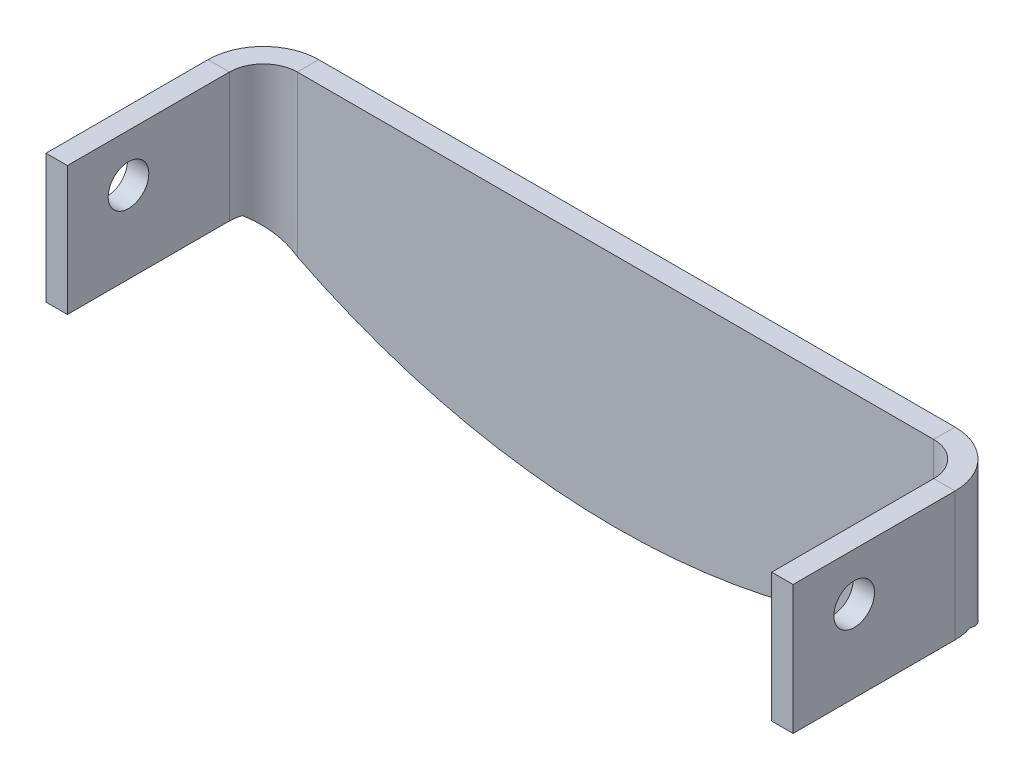
ISO-10303-21;
HEADER;
FILE_DESCRIPTION(('STEP AP214'),'2;1');
FILE_NAME('part.step','',(''),(''),'','','');
FILE_SCHEMA(('AUTOMOTIVE_DESIGN { 1 0 10303 214 1 1 1 1 }'));
ENDSEC;
DATA;
#1=APPLICATION_CONTEXT('core data for automotive mechanical design processes');
#2=APPLICATION_PROTOCOL_DEFINITION('international standard','automotive_design',2000,#1);
#3=PRODUCT_CONTEXT('',#1,'mechanical');
#4=PRODUCT('Part','Part','',(#3));
#5=PRODUCT_RELATED_PRODUCT_CATEGORY('part','',(#4));
#6=PRODUCT_DEFINITION_FORMATION('','',#4);
#7=PRODUCT_DEFINITION_CONTEXT('part definition',#1,'design');
#8=PRODUCT_DEFINITION('design','',#6,#7);
#9=PRODUCT_DEFINITION_SHAPE('','',#8);
#10=(LENGTH_UNIT() NAMED_UNIT(*) SI_UNIT(.MILLI.,.METRE.));
#11=(NAMED_UNIT(*) PLANE_ANGLE_UNIT() SI_UNIT($,.RADIAN.));
#12=(NAMED_UNIT(*) SI_UNIT($,.STERADIAN.) SOLID_ANGLE_UNIT());
#13=UNCERTAINTY_MEASURE_WITH_UNIT(LENGTH_MEASURE(1.E-05),#10,'distance_accuracy_value','');
#14=(GEOMETRIC_REPRESENTATION_CONTEXT(3) GLOBAL_UNCERTAINTY_ASSIGNED_CONTEXT((#13)) GLOBAL_UNIT_ASSIGNED_CONTEXT((#10,
#11,#12)) REPRESENTATION_CONTEXT('',''));
#15=CARTESIAN_POINT('',(0.,0.,0.));
#16=DIRECTION('',(0.,0.,1.));
#17=DIRECTION('',(1.,0.,0.));
#18=AXIS2_PLACEMENT_3D('',#15,#16,#17);
#19=CARTESIAN_POINT('',(0.,44.2833700829048,-0.3998));
#20=DIRECTION('',(0.,0.,1.));
#21=DIRECTION('',(1.,0.,0.));
#22=AXIS2_PLACEMENT_3D('',#19,#20,#21);
#23=PLANE('',#22);
#24=DIRECTION('',(1.,0.,0.));
#25=VECTOR('',#24,1.);
#26=CARTESIAN_POINT('',(0.,0.,-0.3998));
#27=LINE('',#26,#25);
#28=CARTESIAN_POINT('',(29.7536626678157,0.,-0.3998));
#29=VERTEX_POINT('',#28);
#30=CARTESIAN_POINT('',(-29.7536626678156,0.,-0.3998));
#31=VERTEX_POINT('',#30);
#32=EDGE_CURVE('E73',#29,#31,#27,.F.);
#33=ORIENTED_EDGE('',*,*,#32,.F.);
#34=DIRECTION('',(0.,-1.,0.));
#35=VECTOR('',#34,1.);
#36=CARTESIAN_POINT('',(29.7536626678157,44.2833700829048,-0.3998));
#37=LINE('',#36,#35);
#38=CARTESIAN_POINT('',(29.7536626678157,-14.9586251050515,-0.3998));
#39=VERTEX_POINT('',#38);
#40=EDGE_CURVE('E65',#29,#39,#37,.T.);
#41=ORIENTED_EDGE('',*,*,#40,.T.);
#42=CARTESIAN_POINT('',(0.,44.2833700829048,-0.3998));
#43=DIRECTION('',(0.,0.,1.));
#44=DIRECTION('',(1.,0.,0.));
#45=AXIS2_PLACEMENT_3D('',#42,#43,#44);
#46=CIRCLE('',#45,66.294);
#47=CARTESIAN_POINT('',(-29.7536626678156,-14.9586251050515,-0.3998));
#48=VERTEX_POINT('',#47);
#49=EDGE_CURVE('E81',#48,#39,#46,.T.);
#50=ORIENTED_EDGE('',*,*,#49,.F.);
#51=DIRECTION('',(0.,-1.,0.));
#52=VECTOR('',#51,1.);
#53=CARTESIAN_POINT('',(-29.7536626678156,44.2833700829048,-0.3998));
#54=LINE('',#53,#52);
#55=EDGE_CURVE('E542',#31,#48,#54,.T.);
#56=ORIENTED_EDGE('',*,*,#55,.F.);
#57=EDGE_LOOP('',(#33,#41,#50,#56));
#58=FACE_BOUND('',#57,.T.);
#59=ADVANCED_FACE('F56',(#58),#23,.F.);
#60=CARTESIAN_POINT('',(0.,44.2833700829048,1.6002));
#61=DIRECTION('',(0.,0.,1.));
#62=DIRECTION('',(1.,0.,0.));
#63=AXIS2_PLACEMENT_3D('',#60,#61,#62);
#64=CYLINDRICAL_SURFACE('',#63,66.294);
#65=CARTESIAN_POINT('',(29.7536626678157,-14.9586251050515,1.6002));
#66=CARTESIAN_POINT('',(29.7536626678156,-14.9586251050515,-0.3998));
#67=B_SPLINE_CURVE_WITH_KNOTS('',1,(#65,#66),.UNSPECIFIED.,.F.,.F.,(2,2),(0.,1.),.UNSPECIFIED.);
#68=CARTESIAN_POINT('',(29.7536626678157,-14.9586251050515,1.6002));
#69=VERTEX_POINT('',#68);
#70=EDGE_CURVE('E269',#69,#39,#67,.T.);
#71=ORIENTED_EDGE('',*,*,#70,.F.);
#72=CARTESIAN_POINT('',(0.,44.2833700829048,1.6002));
#73=DIRECTION('',(0.,0.,1.));
#74=DIRECTION('',(1.,0.,0.));
#75=AXIS2_PLACEMENT_3D('',#72,#73,#74);
#76=CIRCLE('',#75,66.294);
#77=CARTESIAN_POINT('',(-29.7536626678156,-14.9586251050515,1.6002));
#78=VERTEX_POINT('',#77);
#79=EDGE_CURVE('E462',#78,#69,#76,.T.);
#80=ORIENTED_EDGE('',*,*,#79,.F.);
#81=CARTESIAN_POINT('',(-29.7536626678156,-14.9586251050515,-0.3998));
#82=CARTESIAN_POINT('',(-29.7536626678156,-14.9586251050515,1.6002));
#83=B_SPLINE_CURVE_WITH_KNOTS('',1,(#81,#82),.UNSPECIFIED.,.F.,.F.,(2,2),(0.,1.),.UNSPECIFIED.);
#84=EDGE_CURVE('E463',#78,#48,#83,.F.);
#85=ORIENTED_EDGE('',*,*,#84,.T.);
#86=ORIENTED_EDGE('',*,*,#49,.T.);
#87=EDGE_LOOP('',(#71,#80,#85,#86));
#88=FACE_BOUND('',#87,.T.);
#89=ADVANCED_FACE('F401',(#88),#64,.T.);
#90=CARTESIAN_POINT('',(0.,0.,1.6002));
#91=DIRECTION('',(0.,1.,0.));
#92=DIRECTION('',(-1.,0.,0.));
#93=AXIS2_PLACEMENT_3D('',#90,#91,#92);
#94=PLANE('',#93);
#95=DIRECTION('',(0.,0.,1.));
#96=VECTOR('',#95,1.);
#97=CARTESIAN_POINT('',(29.7536626678157,0.,1.6002));
#98=LINE('',#97,#96);
#99=CARTESIAN_POINT('',(29.7536626678157,0.,1.6002));
#100=VERTEX_POINT('',#99);
#101=EDGE_CURVE('E12',#29,#100,#98,.T.);
#102=ORIENTED_EDGE('',*,*,#101,.F.);
#103=ORIENTED_EDGE('',*,*,#32,.T.);
#104=DIRECTION('',(0.,0.,1.));
#105=VECTOR('',#104,1.);
#106=CARTESIAN_POINT('',(-29.7536626678156,0.,1.6002));
#107=LINE('',#106,#105);
#108=CARTESIAN_POINT('',(-29.7536626678156,0.,1.6002));
#109=VERTEX_POINT('',#108);
#110=EDGE_CURVE('E517',#31,#109,#107,.T.);
#111=ORIENTED_EDGE('',*,*,#110,.T.);
#112=DIRECTION('',(-1.,0.,0.));
#113=VECTOR('',#112,1.);
#114=CARTESIAN_POINT('',(0.,0.,1.6002));
#115=LINE('',#114,#113);
#116=EDGE_CURVE('E459',#100,#109,#115,.T.);
#117=ORIENTED_EDGE('',*,*,#116,.F.);
#118=EDGE_LOOP('',(#102,#103,#111,#117));
#119=FACE_BOUND('',#118,.T.);
#120=ADVANCED_FACE('F58',(#119),#94,.T.);
#121=CARTESIAN_POINT('',(0.,44.2833700829048,1.6002));
#122=DIRECTION('',(0.,0.,1.));
#123=DIRECTION('',(1.,0.,0.));
#124=AXIS2_PLACEMENT_3D('',#121,#122,#123);
#125=PLANE('',#124);
#126=DIRECTION('',(0.,-1.,0.));
#127=VECTOR('',#126,1.);
#128=CARTESIAN_POINT('',(29.7536626678157,44.2833700829048,1.6002));
#129=LINE('',#128,#127);
#130=EDGE_CURVE('E458',#100,#69,#129,.T.);
#131=ORIENTED_EDGE('',*,*,#130,.F.);
#132=ORIENTED_EDGE('',*,*,#116,.T.);
#133=DIRECTION('',(0.,-1.,0.));
#134=VECTOR('',#133,1.);
#135=CARTESIAN_POINT('',(-29.7536626678156,44.2833700829048,1.6002));
#136=LINE('',#135,#134);
#137=EDGE_CURVE('E515',#109,#78,#136,.T.);
#138=ORIENTED_EDGE('',*,*,#137,.T.);
#139=ORIENTED_EDGE('',*,*,#79,.T.);
#140=EDGE_LOOP('',(#131,#132,#138,#139));
#141=FACE_BOUND('',#140,.T.);
#142=ADVANCED_FACE('F442',(#141),#125,.T.);
#143=CARTESIAN_POINT('',(-29.7536626678156,0.,4.7752));
#144=DIRECTION('',(0.,-1.,0.));
#145=DIRECTION('',(0.,0.,-1.));
#146=AXIS2_PLACEMENT_3D('',#143,#144,#145);
#147=PLANE('',#146);
#148=ORIENTED_EDGE('',*,*,#110,.F.);
#149=CARTESIAN_POINT('',(-29.7536626678156,0.,4.7752));
#150=DIRECTION('',(0.,-1.,0.));
#151=DIRECTION('',(0.,0.,-1.));
#152=AXIS2_PLACEMENT_3D('',#149,#150,#151);
#153=CIRCLE('',#152,5.175);
#154=CARTESIAN_POINT('',(-34.9286626678156,0.,4.77520000000001));
#155=VERTEX_POINT('',#154);
#156=EDGE_CURVE('E345',#31,#155,#153,.F.);
#157=ORIENTED_EDGE('',*,*,#156,.T.);
#158=DIRECTION('',(1.,0.,0.));
#159=VECTOR('',#158,1.);
#160=CARTESIAN_POINT('',(-32.9286626678156,0.,4.77520000000001));
#161=LINE('',#160,#159);
#162=CARTESIAN_POINT('',(-32.9286626678156,0.,4.77520000000001));
#163=VERTEX_POINT('',#162);
#164=EDGE_CURVE('E537',#155,#163,#161,.T.);
#165=ORIENTED_EDGE('',*,*,#164,.T.);
#166=CARTESIAN_POINT('',(-29.7536626678156,0.,4.7752));
#167=DIRECTION('',(0.,1.,0.));
#168=DIRECTION('',(0.,0.,1.));
#169=AXIS2_PLACEMENT_3D('',#166,#167,#168);
#170=CIRCLE('',#169,3.175);
#171=EDGE_CURVE('E360',#109,#163,#170,.T.);
#172=ORIENTED_EDGE('',*,*,#171,.F.);
#173=EDGE_LOOP('',(#148,#157,#165,#172));
#174=FACE_BOUND('',#173,.T.);
#175=ADVANCED_FACE('F400',(#174),#147,.F.);
#176=CARTESIAN_POINT('',(-29.7536626678156,-12.065,4.7752));
#177=DIRECTION('',(0.,1.,0.));
#178=DIRECTION('',(0.,0.,1.));
#179=AXIS2_PLACEMENT_3D('',#176,#177,#178);
#180=PLANE('',#179);
#181=DIRECTION('',(-1.,0.,0.));
#182=VECTOR('',#181,1.);
#183=CARTESIAN_POINT('',(-32.9286626678156,-12.065,4.77520000000001));
#184=LINE('',#183,#182);
#185=CARTESIAN_POINT('',(-32.9286626678156,-12.065,4.77520000000001));
#186=VERTEX_POINT('',#185);
#187=CARTESIAN_POINT('',(-34.9286626678156,-12.065,4.77520000000001));
#188=VERTEX_POINT('',#187);
#189=EDGE_CURVE('E534',#186,#188,#184,.T.);
#190=ORIENTED_EDGE('',*,*,#189,.T.);
#191=CARTESIAN_POINT('',(-29.7536626678156,-12.065,4.7752));
#192=DIRECTION('',(0.,-1.,0.));
#193=DIRECTION('',(0.,0.,-1.));
#194=AXIS2_PLACEMENT_3D('',#191,#192,#193);
#195=CIRCLE('',#194,5.175);
#196=CARTESIAN_POINT('',(-34.6458106200696,-12.065,3.08774232252838));
#197=VERTEX_POINT('',#196);
#198=EDGE_CURVE('E372',#188,#197,#195,.T.);
#199=ORIENTED_EDGE('',*,*,#198,.T.);
#200=CARTESIAN_POINT('',(-32.7551254211308,-12.065,3.73989987903915));
#201=CARTESIAN_POINT('',(-34.6458106200696,-12.065,3.08774232252837));
#202=B_SPLINE_CURVE_WITH_KNOTS('',1,(#200,#201),.UNSPECIFIED.,.F.,.F.,(2,2),(0.,1.),.UNSPECIFIED.);
#203=CARTESIAN_POINT('',(-32.7551254211308,-12.065,3.73989987903915));
#204=VERTEX_POINT('',#203);
#205=EDGE_CURVE('E428',#197,#204,#202,.F.);
#206=ORIENTED_EDGE('',*,*,#205,.T.);
#207=CARTESIAN_POINT('',(-29.7536626678156,-12.065,4.7752));
#208=DIRECTION('',(0.,-1.,0.));
#209=DIRECTION('',(0.,0.,-1.));
#210=AXIS2_PLACEMENT_3D('',#207,#208,#209);
#211=CIRCLE('',#210,3.175);
#212=EDGE_CURVE('E358',#186,#204,#211,.T.);
#213=ORIENTED_EDGE('',*,*,#212,.F.);
#214=EDGE_LOOP('',(#190,#199,#206,#213));
#215=FACE_BOUND('',#214,.T.);
#216=ADVANCED_FACE('F337',(#215),#180,.F.);
#217=CARTESIAN_POINT('',(-34.6458106200696,-12.065,3.08774232252837));
#218=CARTESIAN_POINT('',(-34.4716206016857,-12.306149436286,2.58274397316728));
#219=CARTESIAN_POINT('',(-34.2186740264344,-12.5472708508419,2.10506313008778));
#220=CARTESIAN_POINT('',(-33.5791191147394,-13.0295417016838,1.24931850605436));
#221=CARTESIAN_POINT('',(-33.1926184625583,-13.2706771271048,0.87141460906664));
#222=CARTESIAN_POINT('',(-32.3227067930271,-13.7529479779467,0.251267018691005));
#223=CARTESIAN_POINT('',(-31.839428480241,-13.9940834033676,0.00911792848923615));
#224=CARTESIAN_POINT('',(-30.8219113486426,-14.4763542542096,-0.316440412732447));
#225=CARTESIAN_POINT('',(-30.2878587885073,-14.7174756687655,-0.3998));
#226=CARTESIAN_POINT('',(-29.7536626678156,-14.9586251050515,-0.3998));
#227=CARTESIAN_POINT('',(-32.7551254211308,-12.065,3.73989987903915));
#228=CARTESIAN_POINT('',(-32.6482565765714,-12.3061463675852,3.43007391655653));
#229=CARTESIAN_POINT('',(-32.4930657718957,-12.5472708508419,3.13700008464323));
#230=CARTESIAN_POINT('',(-32.100681840566,-13.0295417016838,2.61197802062272));
#231=CARTESIAN_POINT('',(-31.8635534211119,-13.2706771271048,2.38012393889596));
#232=CARTESIAN_POINT('',(-31.3298394982594,-13.7529479779467,1.99964691484907));
#233=CARTESIAN_POINT('',(-31.033335412637,-13.9940834033676,1.85108201409726));
#234=CARTESIAN_POINT('',(-30.409061616922,-14.4763542542096,1.6513433216569));
#235=CARTESIAN_POINT('',(-30.0814020108396,-14.7174787374663,1.6002));
#236=CARTESIAN_POINT('',(-29.7536626678156,-14.9586251050515,1.6002));
#237=B_SPLINE_SURFACE_WITH_KNOTS('',1,3,((#217,#218,#219,#220,#221,#222,#223,#224,#225,#226),
(#227,#228,#229,#230,#231,#232,#233,#234,#235,#236)),.UNSPECIFIED.,.F.,.F.,.F.,(2,2),(4,2,2,2,
4),(0.,1.),(0.,0.25,0.5,0.75,1.),.UNSPECIFIED.);
#238=CARTESIAN_POINT('',(-34.6458106200696,-12.065,3.08774232252837));
#239=CARTESIAN_POINT('',(-34.4716206016857,-12.306149436286,2.58274397316728));
#240=CARTESIAN_POINT('',(-34.2186740264344,-12.5472708508419,2.10506313008778));
#241=CARTESIAN_POINT('',(-33.5791191147394,-13.0295417016838,1.24931850605436));
#242=CARTESIAN_POINT('',(-33.1926184625583,-13.2706771271048,0.87141460906664));
#243=CARTESIAN_POINT('',(-32.3227067930271,-13.7529479779467,0.251267018691005));
#244=CARTESIAN_POINT('',(-31.839428480241,-13.9940834033676,0.00911792848923615));
#245=CARTESIAN_POINT('',(-30.8219113486426,-14.4763542542096,-0.316440412732447));
#246=CARTESIAN_POINT('',(-30.2878587885073,-14.7174756687655,-0.3998));
#247=CARTESIAN_POINT('',(-29.7536626678156,-14.9586251050515,-0.3998));
#248=B_SPLINE_CURVE_WITH_KNOTS('',3,(#238,#239,#240,#241,#242,#243,#244,#245,#246,#247),
.UNSPECIFIED.,.F.,.F.,(4,2,2,2,4),(0.,0.25,0.5,0.75,1.),.UNSPECIFIED.);
#249=EDGE_CURVE('E368',#197,#48,#248,.T.);
#250=CARTESIAN_POINT('',(-29.7536626678156,-14.9586251050515,1.6002));
#251=CARTESIAN_POINT('',(-30.0814020108396,-14.7174787374663,1.6002));
#252=CARTESIAN_POINT('',(-30.409061616922,-14.4763542542096,1.6513433216569));
#253=CARTESIAN_POINT('',(-31.033335412637,-13.9940834033676,1.85108201409726));
#254=CARTESIAN_POINT('',(-31.3298394982594,-13.7529479779467,1.99964691484907));
#255=CARTESIAN_POINT('',(-31.8635534211119,-13.2706771271048,2.38012393889596));
#256=CARTESIAN_POINT('',(-32.100681840566,-13.0295417016838,2.61197802062272));
#257=CARTESIAN_POINT('',(-32.4930657718957,-12.5472708508419,3.13700008464323));
#258=CARTESIAN_POINT('',(-32.6482565765714,-12.3061463675852,3.43007391655653));
#259=CARTESIAN_POINT('',(-32.7551254211308,-12.065,3.73989987903915));
#260=B_SPLINE_CURVE_WITH_KNOTS('',3,(#250,#251,#252,#253,#254,#255,#256,#257,#258,#259),
.UNSPECIFIED.,.F.,.F.,(4,2,2,2,4),(0.,0.25,0.5,0.75,1.),.UNSPECIFIED.);
#261=EDGE_CURVE('E356',#204,#78,#260,.F.);
#262=ORIENTED_EDGE('',*,*,#249,.T.);
#263=ORIENTED_EDGE('',*,*,#84,.F.);
#264=ORIENTED_EDGE('',*,*,#261,.F.);
#265=ORIENTED_EDGE('',*,*,#205,.F.);
#266=EDGE_LOOP('',(#262,#263,#264,#265));
#267=FACE_BOUND('',#266,.T.);
#268=ADVANCED_FACE('F335',(#267),#237,.F.);
#269=CARTESIAN_POINT('',(-29.7536626678156,8.97574163568377,4.7752));
#270=DIRECTION('',(0.,-1.,0.));
#271=DIRECTION('',(0.,0.,-1.));
#272=AXIS2_PLACEMENT_3D('',#269,#270,#271);
#273=CYLINDRICAL_SURFACE('',#272,3.175);
#274=ORIENTED_EDGE('',*,*,#212,.T.);
#275=ORIENTED_EDGE('',*,*,#261,.T.);
#276=ORIENTED_EDGE('',*,*,#137,.F.);
#277=ORIENTED_EDGE('',*,*,#171,.T.);
#278=DIRECTION('',(0.,-1.,0.));
#279=VECTOR('',#278,1.);
#280=CARTESIAN_POINT('',(-32.9286626678156,44.2833700829048,4.77520000000001));
#281=LINE('',#280,#279);
#282=EDGE_CURVE('E531',#163,#186,#281,.T.);
#283=ORIENTED_EDGE('',*,*,#282,.T.);
#284=EDGE_LOOP('',(#274,#275,#276,#277,#283));
#285=FACE_BOUND('',#284,.T.);
#286=ADVANCED_FACE('F331',(#285),#273,.F.);
#287=CARTESIAN_POINT('',(-29.7536626678156,8.97574163568377,4.7752));
#288=DIRECTION('',(0.,-1.,0.));
#289=DIRECTION('',(0.,0.,-1.));
#290=AXIS2_PLACEMENT_3D('',#287,#288,#289);
#291=CYLINDRICAL_SURFACE('',#290,5.175);
#292=ORIENTED_EDGE('',*,*,#198,.F.);
#293=DIRECTION('',(0.,-1.,0.));
#294=VECTOR('',#293,1.);
#295=CARTESIAN_POINT('',(-34.9286626678156,44.2833700829048,4.77520000000001));
#296=LINE('',#295,#294);
#297=EDGE_CURVE('E591',#155,#188,#296,.T.);
#298=ORIENTED_EDGE('',*,*,#297,.F.);
#299=ORIENTED_EDGE('',*,*,#156,.F.);
#300=ORIENTED_EDGE('',*,*,#55,.T.);
#301=ORIENTED_EDGE('',*,*,#249,.F.);
#302=EDGE_LOOP('',(#292,#298,#299,#300,#301));
#303=FACE_BOUND('',#302,.T.);
#304=ADVANCED_FACE('F310',(#303),#291,.T.);
#305=CARTESIAN_POINT('',(-32.9286626678156,-4.445,14.2088626678157));
#306=DIRECTION('',(1.,0.,0.));
#307=DIRECTION('',(0.,0.,-1.));
#308=AXIS2_PLACEMENT_3D('',#305,#306,#307);
#309=CYLINDRICAL_SURFACE('',#308,1.89865);
#310=CARTESIAN_POINT('',(-32.9286626678156,-4.445,14.2088626678157));
#311=DIRECTION('',(1.,0.,0.));
#312=DIRECTION('',(0.,0.,-1.));
#313=AXIS2_PLACEMENT_3D('',#310,#311,#312);
#314=CIRCLE('',#313,1.89865);
#315=CARTESIAN_POINT('',(-32.9286626678156,-4.445,12.3102126678157));
#316=VERTEX_POINT('',#315);
#317=EDGE_CURVE('E567',#316,#316,#314,.T.);
#318=ORIENTED_EDGE('',*,*,#317,.T.);
#319=EDGE_LOOP('',(#318));
#320=FACE_BOUND('',#319,.T.);
#321=CARTESIAN_POINT('',(-34.9286626678156,-4.445,14.2088626678157));
#322=DIRECTION('',(1.,0.,0.));
#323=DIRECTION('',(0.,0.,-1.));
#324=AXIS2_PLACEMENT_3D('',#321,#322,#323);
#325=CIRCLE('',#324,1.89865);
#326=CARTESIAN_POINT('',(-34.9286626678156,-4.445,12.3102126678157));
#327=VERTEX_POINT('',#326);
#328=EDGE_CURVE('E589',#327,#327,#325,.T.);
#329=ORIENTED_EDGE('',*,*,#328,.F.);
#330=EDGE_LOOP('',(#329));
#331=FACE_BOUND('',#330,.T.);
#332=ADVANCED_FACE('F306',(#320,#331),#309,.F.);
#333=CARTESIAN_POINT('',(-32.9286626678156,0.,19.9238626678157));
#334=DIRECTION('',(0.,0.,1.));
#335=DIRECTION('',(0.,-1.,0.));
#336=AXIS2_PLACEMENT_3D('',#333,#334,#335);
#337=PLANE('',#336);
#338=DIRECTION('',(0.,1.,0.));
#339=VECTOR('',#338,1.);
#340=CARTESIAN_POINT('',(-34.9286626678156,44.2833700829048,19.9238626678157));
#341=LINE('',#340,#339);
#342=CARTESIAN_POINT('',(-34.9286626678156,0.,19.9238626678157));
#343=VERTEX_POINT('',#342);
#344=CARTESIAN_POINT('',(-34.9286626678156,-12.065,19.9238626678157));
#345=VERTEX_POINT('',#344);
#346=EDGE_CURVE('E569',#343,#345,#341,.F.);
#347=ORIENTED_EDGE('',*,*,#346,.T.);
#348=DIRECTION('',(1.,0.,0.));
#349=VECTOR('',#348,1.);
#350=CARTESIAN_POINT('',(-32.9286626678156,-12.065,19.9238626678157));
#351=LINE('',#350,#349);
#352=CARTESIAN_POINT('',(-32.9286626678156,-12.065,19.9238626678157));
#353=VERTEX_POINT('',#352);
#354=EDGE_CURVE('E574',#345,#353,#351,.T.);
#355=ORIENTED_EDGE('',*,*,#354,.T.);
#356=DIRECTION('',(0.,-1.,0.));
#357=VECTOR('',#356,1.);
#358=CARTESIAN_POINT('',(-32.9286626678156,0.,19.9238626678157));
#359=LINE('',#358,#357);
#360=CARTESIAN_POINT('',(-32.9286626678156,0.,19.9238626678157));
#361=VERTEX_POINT('',#360);
#362=EDGE_CURVE('E578',#361,#353,#359,.T.);
#363=ORIENTED_EDGE('',*,*,#362,.F.);
#364=DIRECTION('',(1.,0.,0.));
#365=VECTOR('',#364,1.);
#366=CARTESIAN_POINT('',(-32.9286626678156,0.,19.9238626678157));
#367=LINE('',#366,#365);
#368=EDGE_CURVE('E586',#343,#361,#367,.T.);
#369=ORIENTED_EDGE('',*,*,#368,.F.);
#370=EDGE_LOOP('',(#347,#355,#363,#369));
#371=FACE_BOUND('',#370,.T.);
#372=ADVANCED_FACE('F309',(#371),#337,.T.);
#373=CARTESIAN_POINT('',(-32.9286626678158,44.2833700829048,-31.5365373321843));
#374=DIRECTION('',(1.,0.,0.));
#375=DIRECTION('',(0.,0.,-1.));
#376=AXIS2_PLACEMENT_3D('',#373,#374,#375);
#377=PLANE('',#376);
#378=ORIENTED_EDGE('',*,*,#282,.F.);
#379=DIRECTION('',(0.,0.,1.));
#380=VECTOR('',#379,1.);
#381=CARTESIAN_POINT('',(-32.9286626678158,0.,-31.5365373321843));
#382=LINE('',#381,#380);
#383=EDGE_CURVE('E576',#163,#361,#382,.T.);
#384=ORIENTED_EDGE('',*,*,#383,.T.);
#385=ORIENTED_EDGE('',*,*,#362,.T.);
#386=DIRECTION('',(0.,0.,-1.));
#387=VECTOR('',#386,1.);
#388=CARTESIAN_POINT('',(-32.9286626678156,-12.065,19.9238626678157));
#389=LINE('',#388,#387);
#390=EDGE_CURVE('E581',#353,#186,#389,.T.);
#391=ORIENTED_EDGE('',*,*,#390,.T.);
#392=EDGE_LOOP('',(#378,#384,#385,#391));
#393=FACE_BOUND('',#392,.T.);
#394=ORIENTED_EDGE('',*,*,#317,.F.);
#395=EDGE_LOOP('',(#394));
#396=FACE_BOUND('',#395,.T.);
#397=ADVANCED_FACE('F314',(#393,#396),#377,.T.);
#398=CARTESIAN_POINT('',(-32.9286626678158,0.,-31.5365373321843));
#399=DIRECTION('',(0.,1.,0.));
#400=DIRECTION('',(0.,0.,1.));
#401=AXIS2_PLACEMENT_3D('',#398,#399,#400);
#402=PLANE('',#401);
#403=ORIENTED_EDGE('',*,*,#164,.F.);
#404=DIRECTION('',(0.,0.,-1.));
#405=VECTOR('',#404,1.);
#406=CARTESIAN_POINT('',(-34.9286626678158,0.,-31.5365373321843));
#407=LINE('',#406,#405);
#408=EDGE_CURVE('E584',#155,#343,#407,.F.);
#409=ORIENTED_EDGE('',*,*,#408,.T.);
#410=ORIENTED_EDGE('',*,*,#368,.T.);
#411=ORIENTED_EDGE('',*,*,#383,.F.);
#412=EDGE_LOOP('',(#403,#409,#410,#411));
#413=FACE_BOUND('',#412,.T.);
#414=ADVANCED_FACE('F318',(#413),#402,.T.);
#415=CARTESIAN_POINT('',(-34.9286626678158,44.2833700829048,-31.5365373321843));
#416=DIRECTION('',(1.,0.,0.));
#417=DIRECTION('',(0.,0.,-1.));
#418=AXIS2_PLACEMENT_3D('',#415,#416,#417);
#419=PLANE('',#418);
#420=ORIENTED_EDGE('',*,*,#328,.T.);
#421=EDGE_LOOP('',(#420));
#422=FACE_BOUND('',#421,.T.);
#423=ORIENTED_EDGE('',*,*,#408,.F.);
#424=ORIENTED_EDGE('',*,*,#297,.T.);
#425=DIRECTION('',(0.,0.,-1.));
#426=VECTOR('',#425,1.);
#427=CARTESIAN_POINT('',(-34.9286626678158,-12.065,-31.5365373321843));
#428=LINE('',#427,#426);
#429=EDGE_CURVE('E295',#345,#188,#428,.T.);
#430=ORIENTED_EDGE('',*,*,#429,.F.);
#431=ORIENTED_EDGE('',*,*,#346,.F.);
#432=EDGE_LOOP('',(#423,#424,#430,#431));
#433=FACE_BOUND('',#432,.T.);
#434=ADVANCED_FACE('F322',(#422,#433),#419,.F.);
#435=CARTESIAN_POINT('',(-32.9286626678156,-12.065,19.9238626678157));
#436=DIRECTION('',(0.,-1.,0.));
#437=DIRECTION('',(0.,0.,-1.));
#438=AXIS2_PLACEMENT_3D('',#435,#436,#437);
#439=PLANE('',#438);
#440=ORIENTED_EDGE('',*,*,#189,.F.);
#441=ORIENTED_EDGE('',*,*,#390,.F.);
#442=ORIENTED_EDGE('',*,*,#354,.F.);
#443=ORIENTED_EDGE('',*,*,#429,.T.);
#444=EDGE_LOOP('',(#440,#441,#442,#443));
#445=FACE_BOUND('',#444,.T.);
#446=ADVANCED_FACE('F326',(#445),#439,.T.);
#447=CARTESIAN_POINT('',(29.7536626678157,0.,4.7752));
#448=DIRECTION('',(0.,-1.,0.));
#449=DIRECTION('',(0.,0.,-1.));
#450=AXIS2_PLACEMENT_3D('',#447,#448,#449);
#451=PLANE('',#450);
#452=DIRECTION('',(-1.,0.,0.));
#453=VECTOR('',#452,1.);
#454=CARTESIAN_POINT('',(32.9286626678157,0.,4.77520000000001));
#455=LINE('',#454,#453);
#456=CARTESIAN_POINT('',(34.9286626678157,0.,4.77520000000001));
#457=VERTEX_POINT('',#456);
#458=CARTESIAN_POINT('',(32.9286626678157,0.,4.77520000000001));
#459=VERTEX_POINT('',#458);
#460=EDGE_CURVE('E182',#457,#459,#455,.T.);
#461=ORIENTED_EDGE('',*,*,#460,.F.);
#462=CARTESIAN_POINT('',(29.7536626678157,0.,4.7752));
#463=DIRECTION('',(0.,1.,0.));
#464=DIRECTION('',(0.,0.,1.));
#465=AXIS2_PLACEMENT_3D('',#462,#463,#464);
#466=CIRCLE('',#465,5.175);
#467=EDGE_CURVE('E202',#457,#29,#466,.T.);
#468=ORIENTED_EDGE('',*,*,#467,.T.);
#469=ORIENTED_EDGE('',*,*,#101,.T.);
#470=CARTESIAN_POINT('',(29.7536626678157,0.,4.7752));
#471=DIRECTION('',(0.,1.,0.));
#472=DIRECTION('',(0.,0.,1.));
#473=AXIS2_PLACEMENT_3D('',#470,#471,#472);
#474=CIRCLE('',#473,3.175);
#475=EDGE_CURVE('E193',#459,#100,#474,.T.);
#476=ORIENTED_EDGE('',*,*,#475,.F.);
#477=EDGE_LOOP('',(#461,#468,#469,#476));
#478=FACE_BOUND('',#477,.T.);
#479=ADVANCED_FACE('F305',(#478),#451,.F.);
#480=CARTESIAN_POINT('',(29.7536626678156,-14.9586251050515,-0.3998));
#481=CARTESIAN_POINT('',(30.3233033129576,-14.7108733709871,-0.399800000000001));
#482=CARTESIAN_POINT('',(30.8927451793233,-14.4682178470225,-0.304913907806513));
#483=CARTESIAN_POINT('',(31.7009843985807,-14.1117941651121,-0.0278899843713251));
#484=CARTESIAN_POINT('',(31.9627540769514,-13.9942509113211,0.0867407132773641));
#485=CARTESIAN_POINT('',(32.3386137522747,-13.8198329909031,0.289786922562521));
#486=CARTESIAN_POINT('',(32.4611050417047,-13.7620098441418,0.362643101967417));
#487=CARTESIAN_POINT('',(32.6400236674426,-13.6757493640671,0.479316554606139));
#488=CARTESIAN_POINT('',(32.6988604735479,-13.64707491072,0.519438695375697));
#489=CARTESIAN_POINT('',(32.7858364205135,-13.6041817907163,0.58141713930522));
#490=CARTESIAN_POINT('',(32.8146152143751,-13.5899038440511,0.602375793668115));
#491=CARTESIAN_POINT('',(32.8574544301648,-13.5685165640576,0.634255840356825));
#492=CARTESIAN_POINT('',(32.8716793410294,-13.5613924107271,0.644956198131303));
#493=CARTESIAN_POINT('',(32.8929333297693,-13.5507135907325,0.66111639361503));
#494=CARTESIAN_POINT('',(32.9000040965148,-13.5471552190678,0.66652140179108));
#495=CARTESIAN_POINT('',(32.9105892612173,-13.541819514071,0.674656220669517));
#496=CARTESIAN_POINT('',(32.9141141518879,-13.5400412544888,0.677372378057132));
#497=CARTESIAN_POINT('',(32.9193962239553,-13.5373743282405,0.6814534272241));
#498=CARTESIAN_POINT('',(32.9211560373217,-13.5364854300119,0.682814912460208));
#499=CARTESIAN_POINT('',(32.9246739064813,-13.5347077879298,0.685540151694876));
#500=CARTESIAN_POINT('',(32.9275407178164,-13.5332583066506,0.68776513228087));
#501=CARTESIAN_POINT('',(33.0111868980969,-13.4909554346309,0.752737357151293));
#502=CARTESIAN_POINT('',(33.1510275523264,-13.4094362179746,0.863489290088614));
#503=CARTESIAN_POINT('',(33.4228731133242,-13.2278409821748,1.12372691839223));
#504=CARTESIAN_POINT('',(33.5236069932773,-13.157423168439,1.22634758340014));
#505=CARTESIAN_POINT('',(33.6844450710851,-13.0369673451313,1.4082834772571));
#506=CARTESIAN_POINT('',(33.7396602632518,-12.9943438869115,1.4736006120511));
#507=CARTESIAN_POINT('',(33.824007701667,-12.9267014239058,1.57911741459428));
#508=CARTESIAN_POINT('',(33.8523761563271,-12.9035360569578,1.61554643255501));
#509=CARTESIAN_POINT('',(33.8951842910938,-12.867861187617,1.67213971606853));
#510=CARTESIAN_POINT('',(33.9094961479321,-12.8558150946835,1.69132908298613));
#511=CARTESIAN_POINT('',(33.9310113288584,-12.8375142505536,1.72060839867265));
#512=CARTESIAN_POINT('',(33.9381909489149,-12.831375351722,1.73045071303216));
#513=CARTESIAN_POINT('',(33.9489701222446,-12.8221090772922,1.74533896329125));
#514=CARTESIAN_POINT('',(33.9525648035039,-12.8190106647852,1.75032250970554));
#515=CARTESIAN_POINT('',(33.9597570588831,-12.8127945310437,1.76033135446852));
#516=CARTESIAN_POINT('',(33.9642225948368,-12.8089225553247,1.76657369859584));
#517=CARTESIAN_POINT('',(34.3165061262651,-12.5027899316462,2.26054148348916));
#518=CARTESIAN_POINT('',(34.519306702183,-12.2549138167561,2.72099186051488));
#519=CARTESIAN_POINT('',(34.6458106200696,-12.065,3.08774232252838));
#520=CARTESIAN_POINT('',(29.7536626678157,-14.9586251050515,1.6002));
#521=CARTESIAN_POINT('',(30.1031468006201,-14.7108772971136,1.6002));
#522=CARTESIAN_POINT('',(30.4525200541029,-14.4682178470225,1.65841513868876));
#523=CARTESIAN_POINT('',(30.9483962900725,-14.1117941651121,1.82837667625527));
#524=CARTESIAN_POINT('',(31.1089989429859,-13.9942509113211,1.89870565500592));
#525=CARTESIAN_POINT('',(31.3395988404065,-13.8198329909031,2.02327989934995));
#526=CARTESIAN_POINT('',(31.4147505010713,-13.7620098441418,2.06797910120706));
#527=CARTESIAN_POINT('',(31.524521831838,-13.6757493640671,2.13956136442019));
#528=CARTESIAN_POINT('',(31.5606197756804,-13.64707491072,2.16417736382953));
#529=CARTESIAN_POINT('',(31.6139818300989,-13.6041817907163,2.20220278595054));
#530=CARTESIAN_POINT('',(31.6316383847869,-13.5899038440511,2.21506147727464));
#531=CARTESIAN_POINT('',(31.657921381914,-13.5685165640576,2.23462073297255));
#532=CARTESIAN_POINT('',(31.6666487426859,-13.5613924107271,2.24118568677621));
#533=CARTESIAN_POINT('',(31.6796886294974,-13.5507135907325,2.25110039608265));
#534=CARTESIAN_POINT('',(31.6840267327664,-13.5471552190678,2.25441651220999));
#535=CARTESIAN_POINT('',(31.6905210125596,-13.541819514071,2.25940743973444));
#536=CARTESIAN_POINT('',(31.6926836266426,-13.5400412544888,2.26107387446017));
#537=CARTESIAN_POINT('',(31.6959243182009,-13.5373743282405,2.26357770655778));
#538=CARTESIAN_POINT('',(31.6970040104595,-13.5364854300119,2.26441301392486));
#539=CARTESIAN_POINT('',(31.6991623166588,-13.5347077879298,2.26608502060507));
#540=CARTESIAN_POINT('',(31.7009211815842,-13.5332583066506,2.26745010531242));
#541=CARTESIAN_POINT('',(31.7522403356694,-13.4909554346309,2.30731229158558));
#542=CARTESIAN_POINT('',(31.8380362926121,-13.4094362179746,2.37526154512683));
#543=CARTESIAN_POINT('',(32.004820767234,-13.2278409821748,2.53492424461746));
#544=CARTESIAN_POINT('',(32.0666236790892,-13.157423168439,2.59788474923584));
#545=CARTESIAN_POINT('',(32.1653021132998,-13.0369673451313,2.70950725416257));
#546=CARTESIAN_POINT('',(32.1991781007644,-12.9943438869115,2.74958105183812));
#547=CARTESIAN_POINT('',(32.2509274953476,-12.9267014239058,2.8143184137849));
#548=CARTESIAN_POINT('',(32.2683322960328,-12.9035360569578,2.83666858422457));
#549=CARTESIAN_POINT('',(32.2945962241264,-12.867861187617,2.8713900673464));
#550=CARTESIAN_POINT('',(32.3033769285635,-12.8558150946835,2.88316325381275));
#551=CARTESIAN_POINT('',(32.3165770637211,-12.8375142505536,2.90112689193926));
#552=CARTESIAN_POINT('',(32.3209819513886,-12.831375351722,2.90716541330959));
#553=CARTESIAN_POINT('',(32.3275952606295,-12.8221090772922,2.91629975042507));
#554=CARTESIAN_POINT('',(32.329800693093,-12.8190106647852,2.9193572885633));
#555=CARTESIAN_POINT('',(32.3342133328667,-12.8127945310437,2.92549798076088));
#556=CARTESIAN_POINT('',(32.3369530578238,-12.8089225553247,2.92932782474237));
#557=CARTESIAN_POINT('',(32.5530883645455,-12.5027899316462,3.23239018552234));
#558=CARTESIAN_POINT('',(32.6774432112382,-12.2550819078408,3.51468957058138));
#559=CARTESIAN_POINT('',(32.7551254211309,-12.065,3.73989987903915));
#560=B_SPLINE_SURFACE_WITH_KNOTS('',1,3,((#480,#481,#482,#483,#484,#485,#486,#487,#488,#489,
#490,#491,#492,#493,#494,#495,#496,#497,#498,#499,#500,#501,#502,#503,#504,#505,#506,#507,#508,
#509,#510,#511,#512,#513,#514,#515,#516,#517,#518,#519),(#520,#521,#522,#523,#524,#525,#526,
#527,#528,#529,#530,#531,#532,#533,#534,#535,#536,#537,#538,#539,#540,#541,#542,#543,#544,#545,
#546,#547,#548,#549,#550,#551,#552,#553,#554,#555,#556,#557,#558,#559)),.UNSPECIFIED.,.F.,.F.,
.F.,(2,2),(4,2,2,2,2,2,2,2,2,2,2,2,2,2,2,2,2,2,2,4),(0.,1.),(0.,0.25,0.375,0.4375,0.46875,
0.484375,0.4921875,0.49609375,0.498046875,0.4990234375,0.5,0.625,0.6875,0.71875,0.734375,
0.7421875,0.74609375,0.748046875,0.75,1.),.UNSPECIFIED.);
#561=CARTESIAN_POINT('',(29.7536626678156,-14.9586251050515,-0.3998));
#562=CARTESIAN_POINT('',(30.3233033129576,-14.7108733709871,-0.399800000000001));
#563=CARTESIAN_POINT('',(30.8927451793233,-14.4682178470225,-0.304913907806513));
#564=CARTESIAN_POINT('',(31.7009843985807,-14.1117941651121,-0.0278899843713251));
#565=CARTESIAN_POINT('',(31.9627540769514,-13.9942509113211,0.0867407132773641));
#566=CARTESIAN_POINT('',(32.3386137522747,-13.8198329909031,0.289786922562521));
#567=CARTESIAN_POINT('',(32.4611050417047,-13.7620098441418,0.362643101967417));
#568=CARTESIAN_POINT('',(32.6400236674426,-13.6757493640671,0.479316554606139));
#569=CARTESIAN_POINT('',(32.6988604735479,-13.64707491072,0.519438695375697));
#570=CARTESIAN_POINT('',(32.7858364205135,-13.6041817907163,0.58141713930522));
#571=CARTESIAN_POINT('',(32.8146152143751,-13.5899038440511,0.602375793668115));
#572=CARTESIAN_POINT('',(32.8574544301648,-13.5685165640576,0.634255840356825));
#573=CARTESIAN_POINT('',(32.8716793410294,-13.5613924107271,0.644956198131303));
#574=CARTESIAN_POINT('',(32.8929333297693,-13.5507135907325,0.66111639361503));
#575=CARTESIAN_POINT('',(32.9000040965148,-13.5471552190678,0.66652140179108));
#576=CARTESIAN_POINT('',(32.9105892612173,-13.541819514071,0.674656220669517));
#577=CARTESIAN_POINT('',(32.9141141518879,-13.5400412544888,0.677372378057132));
#578=CARTESIAN_POINT('',(32.9193962239553,-13.5373743282405,0.6814534272241));
#579=CARTESIAN_POINT('',(32.9211560373217,-13.5364854300119,0.682814912460208));
#580=CARTESIAN_POINT('',(32.9246739064813,-13.5347077879298,0.685540151694876));
#581=CARTESIAN_POINT('',(32.9275407178164,-13.5332583066506,0.68776513228087));
#582=CARTESIAN_POINT('',(33.0111868980969,-13.4909554346309,0.752737357151293));
#583=CARTESIAN_POINT('',(33.1510275523264,-13.4094362179746,0.863489290088614));
#584=CARTESIAN_POINT('',(33.4228731133242,-13.2278409821748,1.12372691839223));
#585=CARTESIAN_POINT('',(33.5236069932773,-13.157423168439,1.22634758340014));
#586=CARTESIAN_POINT('',(33.6844450710851,-13.0369673451313,1.4082834772571));
#587=CARTESIAN_POINT('',(33.7396602632518,-12.9943438869115,1.4736006120511));
#588=CARTESIAN_POINT('',(33.824007701667,-12.9267014239058,1.57911741459428));
#589=CARTESIAN_POINT('',(33.8523761563271,-12.9035360569578,1.61554643255501));
#590=CARTESIAN_POINT('',(33.8951842910938,-12.867861187617,1.67213971606853));
#591=CARTESIAN_POINT('',(33.9094961479321,-12.8558150946835,1.69132908298613));
#592=CARTESIAN_POINT('',(33.9310113288584,-12.8375142505536,1.72060839867265));
#593=CARTESIAN_POINT('',(33.9381909489149,-12.831375351722,1.73045071303216));
#594=CARTESIAN_POINT('',(33.9489701222446,-12.8221090772922,1.74533896329125));
#595=CARTESIAN_POINT('',(33.9525648035039,-12.8190106647852,1.75032250970554));
#596=CARTESIAN_POINT('',(33.9597570588831,-12.8127945310437,1.76033135446852));
#597=CARTESIAN_POINT('',(33.9642225948368,-12.8089225553247,1.76657369859584));
#598=CARTESIAN_POINT('',(34.3165061262651,-12.5027899316462,2.26054148348916));
#599=CARTESIAN_POINT('',(34.519306702183,-12.2549138167561,2.72099186051488));
#600=CARTESIAN_POINT('',(34.6458106200696,-12.065,3.08774232252838));
#601=B_SPLINE_CURVE_WITH_KNOTS('',3,(#561,#562,#563,#564,#565,#566,#567,#568,#569,#570,#571,
#572,#573,#574,#575,#576,#577,#578,#579,#580,#581,#582,#583,#584,#585,#586,#587,#588,#589,#590,
#591,#592,#593,#594,#595,#596,#597,#598,#599,#600),.UNSPECIFIED.,.F.,.F.,(4,2,2,2,2,2,2,2,2,2,2,
2,2,2,2,2,2,2,2,4),(0.,0.25,0.375,0.4375,0.46875,0.484375,0.4921875,0.49609375,0.498046875,
0.4990234375,0.5,0.625,0.6875,0.71875,0.734375,0.7421875,0.74609375,0.748046875,0.75,1.),.UNSPECIFIED.);
#602=CARTESIAN_POINT('',(34.6458106200696,-12.065,3.08774232252838));
#603=VERTEX_POINT('',#602);
#604=EDGE_CURVE('E241',#39,#603,#601,.T.);
#605=CARTESIAN_POINT('',(34.6458106200696,-12.065,3.08774232252838));
#606=CARTESIAN_POINT('',(32.7551254211309,-12.065,3.73989987903915));
#607=B_SPLINE_CURVE_WITH_KNOTS('',1,(#605,#606),.UNSPECIFIED.,.F.,.F.,(2,2),(0.,1.),.UNSPECIFIED.);
#608=CARTESIAN_POINT('',(32.7551254211309,-12.065,3.73989987903915));
#609=VERTEX_POINT('',#608);
#610=EDGE_CURVE('E279',#603,#609,#607,.T.);
#611=CARTESIAN_POINT('',(32.7551254211309,-12.065,3.73989987903915));
#612=CARTESIAN_POINT('',(32.6774432112382,-12.2550819078408,3.51468957058138));
#613=CARTESIAN_POINT('',(32.5530883645455,-12.5027899316462,3.23239018552234));
#614=CARTESIAN_POINT('',(32.3369530578238,-12.8089225553247,2.92932782474237));
#615=CARTESIAN_POINT('',(32.3342133328667,-12.8127945310437,2.92549798076088));
#616=CARTESIAN_POINT('',(32.329800693093,-12.8190106647852,2.9193572885633));
#617=CARTESIAN_POINT('',(32.3275952606295,-12.8221090772922,2.91629975042507));
#618=CARTESIAN_POINT('',(32.3209819513886,-12.831375351722,2.90716541330959));
#619=CARTESIAN_POINT('',(32.3165770637211,-12.8375142505536,2.90112689193926));
#620=CARTESIAN_POINT('',(32.3033769285635,-12.8558150946835,2.88316325381275));
#621=CARTESIAN_POINT('',(32.2945962241264,-12.867861187617,2.8713900673464));
#622=CARTESIAN_POINT('',(32.2683322960328,-12.9035360569578,2.83666858422457));
#623=CARTESIAN_POINT('',(32.2509274953476,-12.9267014239058,2.8143184137849));
#624=CARTESIAN_POINT('',(32.1991781007644,-12.9943438869115,2.74958105183812));
#625=CARTESIAN_POINT('',(32.1653021132998,-13.0369673451313,2.70950725416257));
#626=CARTESIAN_POINT('',(32.0666236790892,-13.157423168439,2.59788474923584));
#627=CARTESIAN_POINT('',(32.004820767234,-13.2278409821748,2.53492424461746));
#628=CARTESIAN_POINT('',(31.8380362926121,-13.4094362179746,2.37526154512683));
#629=CARTESIAN_POINT('',(31.7522403356694,-13.4909554346309,2.30731229158558));
#630=CARTESIAN_POINT('',(31.7009211815842,-13.5332583066506,2.26745010531242));
#631=CARTESIAN_POINT('',(31.6991623166588,-13.5347077879298,2.26608502060507));
#632=CARTESIAN_POINT('',(31.6970040104595,-13.5364854300119,2.26441301392486));
#633=CARTESIAN_POINT('',(31.6959243182009,-13.5373743282405,2.26357770655778));
#634=CARTESIAN_POINT('',(31.6926836266426,-13.5400412544888,2.26107387446017));
#635=CARTESIAN_POINT('',(31.6905210125596,-13.541819514071,2.25940743973444));
#636=CARTESIAN_POINT('',(31.6840267327664,-13.5471552190678,2.25441651220999));
#637=CARTESIAN_POINT('',(31.6796886294974,-13.5507135907325,2.25110039608265));
#638=CARTESIAN_POINT('',(31.6666487426859,-13.5613924107271,2.24118568677621));
#639=CARTESIAN_POINT('',(31.657921381914,-13.5685165640576,2.23462073297255));
#640=CARTESIAN_POINT('',(31.6316383847869,-13.5899038440511,2.21506147727464));
#641=CARTESIAN_POINT('',(31.6139818300989,-13.6041817907163,2.20220278595054));
#642=CARTESIAN_POINT('',(31.5606197756804,-13.64707491072,2.16417736382953));
#643=CARTESIAN_POINT('',(31.524521831838,-13.6757493640671,2.13956136442019));
#644=CARTESIAN_POINT('',(31.4147505010713,-13.7620098441418,2.06797910120706));
#645=CARTESIAN_POINT('',(31.3395988404065,-13.8198329909031,2.02327989934995));
#646=CARTESIAN_POINT('',(31.1089989429859,-13.9942509113211,1.89870565500592));
#647=CARTESIAN_POINT('',(30.9483962900725,-14.1117941651121,1.82837667625527));
#648=CARTESIAN_POINT('',(30.4525200541029,-14.4682178470225,1.65841513868876));
#649=CARTESIAN_POINT('',(30.1031468006201,-14.7108772971136,1.6002));
#650=CARTESIAN_POINT('',(29.7536626678157,-14.9586251050515,1.6002));
#651=B_SPLINE_CURVE_WITH_KNOTS('',3,(#611,#612,#613,#614,#615,#616,#617,#618,#619,#620,#621,
#622,#623,#624,#625,#626,#627,#628,#629,#630,#631,#632,#633,#634,#635,#636,#637,#638,#639,#640,
#641,#642,#643,#644,#645,#646,#647,#648,#649,#650),.UNSPECIFIED.,.F.,.F.,(4,2,2,2,2,2,2,2,2,2,2,
2,2,2,2,2,2,2,2,4),(0.,0.25,0.251953125,0.25390625,0.2578125,0.265625,0.28125,0.3125,0.375,0.5,
0.5009765625,0.501953125,0.50390625,0.5078125,0.515625,0.53125,0.5625,0.625,0.75,1.),.UNSPECIFIED.);
#652=EDGE_CURVE('E196',#69,#609,#651,.F.);
#653=ORIENTED_EDGE('',*,*,#70,.T.);
#654=ORIENTED_EDGE('',*,*,#604,.T.);
#655=ORIENTED_EDGE('',*,*,#610,.T.);
#656=ORIENTED_EDGE('',*,*,#652,.F.);
#657=EDGE_LOOP('',(#653,#654,#655,#656));
#658=FACE_BOUND('',#657,.T.);
#659=ADVANCED_FACE('F217',(#658),#560,.F.);
#660=CARTESIAN_POINT('',(29.7536626678157,-12.065,4.7752));
#661=DIRECTION('',(0.,1.,0.));
#662=DIRECTION('',(0.,0.,1.));
#663=AXIS2_PLACEMENT_3D('',#660,#661,#662);
#664=PLANE('',#663);
#665=CARTESIAN_POINT('',(29.7536626678157,-12.065,4.7752));
#666=DIRECTION('',(0.,1.,0.));
#667=DIRECTION('',(0.,0.,1.));
#668=AXIS2_PLACEMENT_3D('',#665,#666,#667);
#669=CIRCLE('',#668,5.175);
#670=CARTESIAN_POINT('',(34.9286626678157,-12.065,4.77520000000001));
#671=VERTEX_POINT('',#670);
#672=EDGE_CURVE('E197',#603,#671,#669,.F.);
#673=ORIENTED_EDGE('',*,*,#672,.T.);
#674=DIRECTION('',(1.,0.,0.));
#675=VECTOR('',#674,1.);
#676=CARTESIAN_POINT('',(32.9286626678157,-12.065,4.77520000000001));
#677=LINE('',#676,#675);
#678=CARTESIAN_POINT('',(32.9286626678157,-12.065,4.77520000000001));
#679=VERTEX_POINT('',#678);
#680=EDGE_CURVE('E491',#679,#671,#677,.T.);
#681=ORIENTED_EDGE('',*,*,#680,.F.);
#682=CARTESIAN_POINT('',(29.7536626678157,-12.065,4.7752));
#683=DIRECTION('',(0.,-1.,0.));
#684=DIRECTION('',(0.,0.,-1.));
#685=AXIS2_PLACEMENT_3D('',#682,#683,#684);
#686=CIRCLE('',#685,3.175);
#687=EDGE_CURVE('E472',#609,#679,#686,.T.);
#688=ORIENTED_EDGE('',*,*,#687,.F.);
#689=ORIENTED_EDGE('',*,*,#610,.F.);
#690=EDGE_LOOP('',(#673,#681,#688,#689));
#691=FACE_BOUND('',#690,.T.);
#692=ADVANCED_FACE('F215',(#691),#664,.F.);
#693=CARTESIAN_POINT('',(29.7536626678157,-23.9343667407352,4.7752));
#694=DIRECTION('',(0.,1.,0.));
#695=DIRECTION('',(0.,0.,1.));
#696=AXIS2_PLACEMENT_3D('',#693,#694,#695);
#697=CYLINDRICAL_SURFACE('',#696,3.175);
#698=ORIENTED_EDGE('',*,*,#652,.T.);
#699=ORIENTED_EDGE('',*,*,#687,.T.);
#700=DIRECTION('',(0.,-1.,0.));
#701=VECTOR('',#700,1.);
#702=CARTESIAN_POINT('',(32.9286626678157,44.2833700829048,4.77520000000001));
#703=LINE('',#702,#701);
#704=EDGE_CURVE('E471',#459,#679,#703,.T.);
#705=ORIENTED_EDGE('',*,*,#704,.F.);
#706=ORIENTED_EDGE('',*,*,#475,.T.);
#707=ORIENTED_EDGE('',*,*,#130,.T.);
#708=EDGE_LOOP('',(#698,#699,#705,#706,#707));
#709=FACE_BOUND('',#708,.T.);
#710=ADVANCED_FACE('F204',(#709),#697,.F.);
#711=CARTESIAN_POINT('',(29.7536626678157,-23.9343667407352,4.7752));
#712=DIRECTION('',(0.,1.,0.));
#713=DIRECTION('',(0.,0.,1.));
#714=AXIS2_PLACEMENT_3D('',#711,#712,#713);
#715=CYLINDRICAL_SURFACE('',#714,5.175);
#716=ORIENTED_EDGE('',*,*,#604,.F.);
#717=ORIENTED_EDGE('',*,*,#40,.F.);
#718=ORIENTED_EDGE('',*,*,#467,.F.);
#719=DIRECTION('',(0.,-1.,0.));
#720=VECTOR('',#719,1.);
#721=CARTESIAN_POINT('',(34.9286626678157,44.2833700829048,4.77520000000001));
#722=LINE('',#721,#720);
#723=EDGE_CURVE('E180',#457,#671,#722,.T.);
#724=ORIENTED_EDGE('',*,*,#723,.T.);
#725=ORIENTED_EDGE('',*,*,#672,.F.);
#726=EDGE_LOOP('',(#716,#717,#718,#724,#725));
#727=FACE_BOUND('',#726,.T.);
#728=ADVANCED_FACE('F214',(#727),#715,.T.);
#729=CARTESIAN_POINT('',(32.9286626678156,0.,19.9238626678156));
#730=DIRECTION('',(0.,0.,1.));
#731=DIRECTION('',(0.,1.,0.));
#732=AXIS2_PLACEMENT_3D('',#729,#730,#731);
#733=PLANE('',#732);
#734=DIRECTION('',(-1.,0.,0.));
#735=VECTOR('',#734,1.);
#736=CARTESIAN_POINT('',(32.9286626678156,-12.065,19.9238626678156));
#737=LINE('',#736,#735);
#738=CARTESIAN_POINT('',(34.9286626678156,-12.065,19.9238626678156));
#739=VERTEX_POINT('',#738);
#740=CARTESIAN_POINT('',(32.9286626678156,-12.065,19.9238626678156));
#741=VERTEX_POINT('',#740);
#742=EDGE_CURVE('E188',#739,#741,#737,.T.);
#743=ORIENTED_EDGE('',*,*,#742,.F.);
#744=DIRECTION('',(0.,1.,0.));
#745=VECTOR('',#744,1.);
#746=CARTESIAN_POINT('',(34.9286626678156,44.2833700829048,19.9238626678156));
#747=LINE('',#746,#745);
#748=CARTESIAN_POINT('',(34.9286626678156,0.,19.9238626678156));
#749=VERTEX_POINT('',#748);
#750=EDGE_CURVE('E173',#739,#749,#747,.T.);
#751=ORIENTED_EDGE('',*,*,#750,.T.);
#752=DIRECTION('',(-1.,0.,0.));
#753=VECTOR('',#752,1.);
#754=CARTESIAN_POINT('',(32.9286626678156,0.,19.9238626678156));
#755=LINE('',#754,#753);
#756=CARTESIAN_POINT('',(32.9286626678156,0.,19.9238626678156));
#757=VERTEX_POINT('',#756);
#758=EDGE_CURVE('E161',#749,#757,#755,.T.);
#759=ORIENTED_EDGE('',*,*,#758,.T.);
#760=DIRECTION('',(0.,1.,0.));
#761=VECTOR('',#760,1.);
#762=CARTESIAN_POINT('',(32.9286626678156,0.,19.9238626678156));
#763=LINE('',#762,#761);
#764=EDGE_CURVE('E477',#741,#757,#763,.T.);
#765=ORIENTED_EDGE('',*,*,#764,.F.);
#766=EDGE_LOOP('',(#743,#751,#759,#765));
#767=FACE_BOUND('',#766,.T.);
#768=ADVANCED_FACE('F186',(#767),#733,.T.);
#769=CARTESIAN_POINT('',(32.9286626678156,-4.445,14.2088626678156));
#770=DIRECTION('',(-1.,0.,0.));
#771=DIRECTION('',(0.,0.,1.));
#772=AXIS2_PLACEMENT_3D('',#769,#770,#771);
#773=CYLINDRICAL_SURFACE('',#772,1.89865);
#774=CARTESIAN_POINT('',(32.9286626678156,-4.445,14.2088626678156));
#775=DIRECTION('',(-1.,0.,0.));
#776=DIRECTION('',(0.,0.,1.));
#777=AXIS2_PLACEMENT_3D('',#774,#775,#776);
#778=CIRCLE('',#777,1.89865);
#779=CARTESIAN_POINT('',(32.9286626678156,-4.445,16.1075126678156));
#780=VERTEX_POINT('',#779);
#781=EDGE_CURVE('E172',#780,#780,#778,.T.);
#782=ORIENTED_EDGE('',*,*,#781,.T.);
#783=EDGE_LOOP('',(#782));
#784=FACE_BOUND('',#783,.T.);
#785=CARTESIAN_POINT('',(34.9286626678156,-4.445,14.2088626678157));
#786=DIRECTION('',(-1.,0.,0.));
#787=DIRECTION('',(0.,0.,1.));
#788=AXIS2_PLACEMENT_3D('',#785,#786,#787);
#789=CIRCLE('',#788,1.89865);
#790=CARTESIAN_POINT('',(34.9286626678156,-4.445,16.1075126678157));
#791=VERTEX_POINT('',#790);
#792=EDGE_CURVE('E183',#791,#791,#789,.T.);
#793=ORIENTED_EDGE('',*,*,#792,.F.);
#794=EDGE_LOOP('',(#793));
#795=FACE_BOUND('',#794,.T.);
#796=ADVANCED_FACE('F484',(#784,#795),#773,.F.);
#797=CARTESIAN_POINT('',(32.9286626678158,44.2833700829048,-31.5365373321844));
#798=DIRECTION('',(-1.,0.,0.));
#799=DIRECTION('',(0.,0.,1.));
#800=AXIS2_PLACEMENT_3D('',#797,#798,#799);
#801=PLANE('',#800);
#802=ORIENTED_EDGE('',*,*,#781,.F.);
#803=EDGE_LOOP('',(#802));
#804=FACE_BOUND('',#803,.T.);
#805=DIRECTION('',(0.,0.,-1.));
#806=VECTOR('',#805,1.);
#807=CARTESIAN_POINT('',(32.9286626678158,0.,-31.5365373321844));
#808=LINE('',#807,#806);
#809=EDGE_CURVE('E167',#757,#459,#808,.T.);
#810=ORIENTED_EDGE('',*,*,#809,.T.);
#811=ORIENTED_EDGE('',*,*,#704,.T.);
#812=DIRECTION('',(0.,0.,1.));
#813=VECTOR('',#812,1.);
#814=CARTESIAN_POINT('',(32.9286626678156,-12.065,19.9238626678156));
#815=LINE('',#814,#813);
#816=EDGE_CURVE('E475',#679,#741,#815,.T.);
#817=ORIENTED_EDGE('',*,*,#816,.T.);
#818=ORIENTED_EDGE('',*,*,#764,.T.);
#819=EDGE_LOOP('',(#810,#811,#817,#818));
#820=FACE_BOUND('',#819,.T.);
#821=ADVANCED_FACE('F487',(#804,#820),#801,.T.);
#822=CARTESIAN_POINT('',(32.9286626678156,-12.065,19.9238626678156));
#823=DIRECTION('',(0.,-1.,0.));
#824=DIRECTION('',(0.,0.,1.));
#825=AXIS2_PLACEMENT_3D('',#822,#823,#824);
#826=PLANE('',#825);
#827=ORIENTED_EDGE('',*,*,#816,.F.);
#828=ORIENTED_EDGE('',*,*,#680,.T.);
#829=DIRECTION('',(0.,0.,1.));
#830=VECTOR('',#829,1.);
#831=CARTESIAN_POINT('',(34.9286626678158,-12.065,-31.5365373321844));
#832=LINE('',#831,#830);
#833=EDGE_CURVE('E493',#671,#739,#832,.T.);
#834=ORIENTED_EDGE('',*,*,#833,.T.);
#835=ORIENTED_EDGE('',*,*,#742,.T.);
#836=EDGE_LOOP('',(#827,#828,#834,#835));
#837=FACE_BOUND('',#836,.T.);
#838=ADVANCED_FACE('F489',(#837),#826,.T.);
#839=CARTESIAN_POINT('',(34.9286626678158,44.2833700829048,-31.5365373321844));
#840=DIRECTION('',(-1.,0.,0.));
#841=DIRECTION('',(0.,0.,1.));
#842=AXIS2_PLACEMENT_3D('',#839,#840,#841);
#843=PLANE('',#842);
#844=ORIENTED_EDGE('',*,*,#723,.F.);
#845=DIRECTION('',(0.,0.,1.));
#846=VECTOR('',#845,1.);
#847=CARTESIAN_POINT('',(34.9286626678158,0.,-31.5365373321844));
#848=LINE('',#847,#846);
#849=EDGE_CURVE('E164',#749,#457,#848,.F.);
#850=ORIENTED_EDGE('',*,*,#849,.F.);
#851=ORIENTED_EDGE('',*,*,#750,.F.);
#852=ORIENTED_EDGE('',*,*,#833,.F.);
#853=EDGE_LOOP('',(#844,#850,#851,#852));
#854=FACE_BOUND('',#853,.T.);
#855=ORIENTED_EDGE('',*,*,#792,.T.);
#856=EDGE_LOOP('',(#855));
#857=FACE_BOUND('',#856,.T.);
#858=ADVANCED_FACE('F177',(#854,#857),#843,.F.);
#859=CARTESIAN_POINT('',(32.9286626678158,0.,-31.5365373321844));
#860=DIRECTION('',(0.,1.,0.));
#861=DIRECTION('',(0.,0.,-1.));
#862=AXIS2_PLACEMENT_3D('',#859,#860,#861);
#863=PLANE('',#862);
#864=ORIENTED_EDGE('',*,*,#849,.T.);
#865=ORIENTED_EDGE('',*,*,#460,.T.);
#866=ORIENTED_EDGE('',*,*,#809,.F.);
#867=ORIENTED_EDGE('',*,*,#758,.F.);
#868=EDGE_LOOP('',(#864,#865,#866,#867));
#869=FACE_BOUND('',#868,.T.);
#870=ADVANCED_FACE('F163',(#869),#863,.T.);
#871=CLOSED_SHELL('',(#59,#89,#120,#142,#175,#216,#268,#286,#304,#332,#372,#397,#414,#434,#446,
#479,#659,#692,#710,#728,#768,#796,#821,#838,#858,#870));
#872=MANIFOLD_SOLID_BREP('B2',#871);
#873=ADVANCED_BREP_SHAPE_REPRESENTATION('',(#18,#872),#14);
#874=SHAPE_DEFINITION_REPRESENTATION(#9,#873);
ENDSEC;
END-ISO-10303-21;
